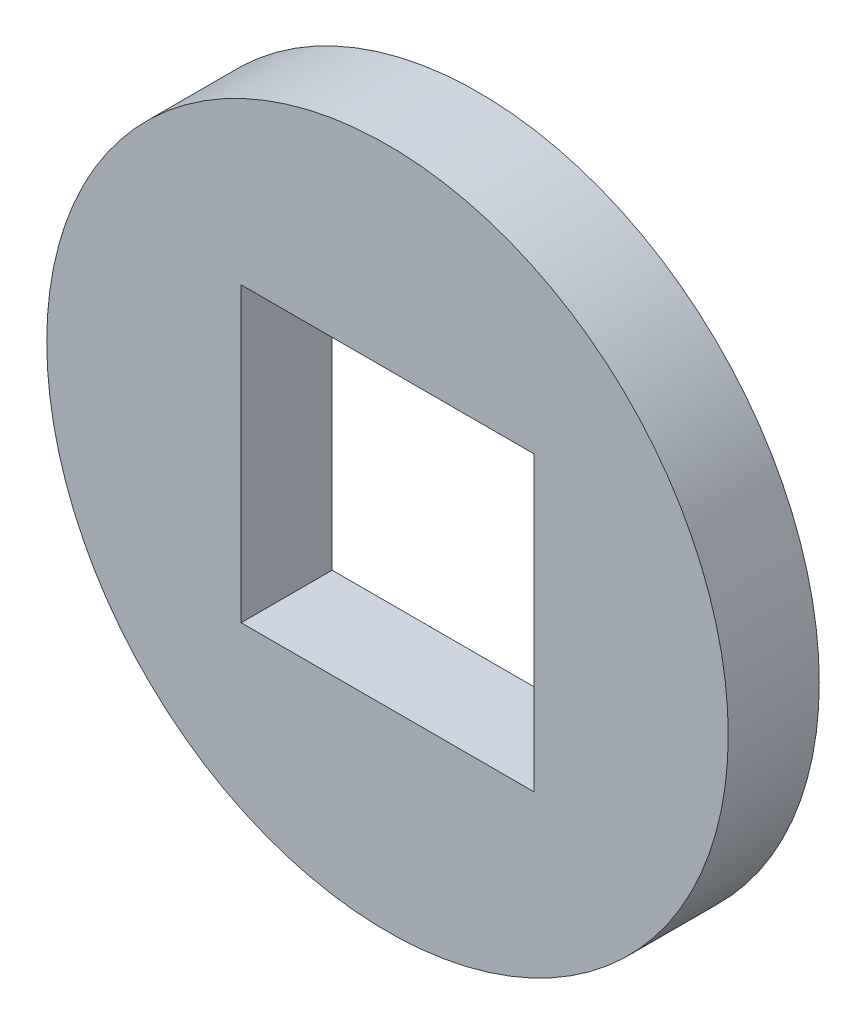
ISO-10303-21;
HEADER;
FILE_DESCRIPTION(('STEP AP214'),'2;1');
FILE_NAME('part.step','',(''),(''),'','','');
FILE_SCHEMA(('AUTOMOTIVE_DESIGN { 1 0 10303 214 1 1 1 1 }'));
ENDSEC;
DATA;
#1=APPLICATION_CONTEXT('core data for automotive mechanical design processes');
#2=APPLICATION_PROTOCOL_DEFINITION('international standard','automotive_design',2000,#1);
#3=PRODUCT_CONTEXT('',#1,'mechanical');
#4=PRODUCT('Part','Part','',(#3));
#5=PRODUCT_RELATED_PRODUCT_CATEGORY('part','',(#4));
#6=PRODUCT_DEFINITION_FORMATION('','',#4);
#7=PRODUCT_DEFINITION_CONTEXT('part definition',#1,'design');
#8=PRODUCT_DEFINITION('design','',#6,#7);
#9=PRODUCT_DEFINITION_SHAPE('','',#8);
#10=(LENGTH_UNIT() NAMED_UNIT(*) SI_UNIT(.MILLI.,.METRE.));
#11=(NAMED_UNIT(*) PLANE_ANGLE_UNIT() SI_UNIT($,.RADIAN.));
#12=(NAMED_UNIT(*) SI_UNIT($,.STERADIAN.) SOLID_ANGLE_UNIT());
#13=UNCERTAINTY_MEASURE_WITH_UNIT(LENGTH_MEASURE(1.E-05),#10,'distance_accuracy_value','');
#14=(GEOMETRIC_REPRESENTATION_CONTEXT(3) GLOBAL_UNCERTAINTY_ASSIGNED_CONTEXT((#13)) GLOBAL_UNIT_ASSIGNED_CONTEXT((#10,
#11,#12)) REPRESENTATION_CONTEXT('',''));
#15=CARTESIAN_POINT('',(0.,0.,0.));
#16=DIRECTION('',(0.,0.,1.));
#17=DIRECTION('',(1.,0.,0.));
#18=AXIS2_PLACEMENT_3D('',#15,#16,#17);
#19=CARTESIAN_POINT('',(0.,0.,2.8829));
#20=DIRECTION('',(0.,0.,1.));
#21=DIRECTION('',(1.,0.,0.));
#22=AXIS2_PLACEMENT_3D('',#19,#20,#21);
#23=PLANE('',#22);
#24=CARTESIAN_POINT('',(0.,0.,2.8829));
#25=DIRECTION('',(0.,0.,1.));
#26=DIRECTION('',(1.,0.,0.));
#27=AXIS2_PLACEMENT_3D('',#24,#25,#26);
#28=CIRCLE('',#27,10.795);
#29=CARTESIAN_POINT('',(-10.795,0.,2.8829));
#30=VERTEX_POINT('',#29);
#31=EDGE_CURVE('E11',#30,#30,#28,.T.);
#32=ORIENTED_EDGE('',*,*,#31,.T.);
#33=EDGE_LOOP('',(#32));
#34=FACE_BOUND('',#33,.T.);
#35=DIRECTION('',(-1.,0.,0.));
#36=VECTOR('',#35,1.);
#37=CARTESIAN_POINT('',(-4.6355,4.6355,2.8829));
#38=LINE('',#37,#36);
#39=CARTESIAN_POINT('',(4.6355,4.6355,2.8829));
#40=VERTEX_POINT('',#39);
#41=CARTESIAN_POINT('',(-4.6355,4.6355,2.8829));
#42=VERTEX_POINT('',#41);
#43=EDGE_CURVE('E82',#40,#42,#38,.T.);
#44=ORIENTED_EDGE('',*,*,#43,.F.);
#45=DIRECTION('',(0.,1.,0.));
#46=VECTOR('',#45,1.);
#47=CARTESIAN_POINT('',(4.6355,4.6355,2.8829));
#48=LINE('',#47,#46);
#49=CARTESIAN_POINT('',(4.6355,-4.6355,2.8829));
#50=VERTEX_POINT('',#49);
#51=EDGE_CURVE('E74',#50,#40,#48,.T.);
#52=ORIENTED_EDGE('',*,*,#51,.F.);
#53=DIRECTION('',(1.,0.,0.));
#54=VECTOR('',#53,1.);
#55=CARTESIAN_POINT('',(-4.6355,-4.6355,2.8829));
#56=LINE('',#55,#54);
#57=CARTESIAN_POINT('',(-4.6355,-4.6355,2.8829));
#58=VERTEX_POINT('',#57);
#59=EDGE_CURVE('E95',#58,#50,#56,.T.);
#60=ORIENTED_EDGE('',*,*,#59,.F.);
#61=DIRECTION('',(0.,-1.,0.));
#62=VECTOR('',#61,1.);
#63=CARTESIAN_POINT('',(-4.6355,4.6355,2.8829));
#64=LINE('',#63,#62);
#65=EDGE_CURVE('E93',#42,#58,#64,.T.);
#66=ORIENTED_EDGE('',*,*,#65,.F.);
#67=EDGE_LOOP('',(#44,#52,#60,#66));
#68=FACE_BOUND('',#67,.T.);
#69=ADVANCED_FACE('F33',(#34,#68),#23,.T.);
#70=CARTESIAN_POINT('',(0.,0.,0.));
#71=DIRECTION('',(0.,0.,1.));
#72=DIRECTION('',(1.,0.,0.));
#73=AXIS2_PLACEMENT_3D('',#70,#71,#72);
#74=PLANE('',#73);
#75=CARTESIAN_POINT('',(0.,0.,0.));
#76=DIRECTION('',(0.,0.,1.));
#77=DIRECTION('',(1.,0.,0.));
#78=AXIS2_PLACEMENT_3D('',#75,#76,#77);
#79=CIRCLE('',#78,10.795);
#80=CARTESIAN_POINT('',(-10.795,0.,0.));
#81=VERTEX_POINT('',#80);
#82=EDGE_CURVE('E37',#81,#81,#79,.T.);
#83=ORIENTED_EDGE('',*,*,#82,.F.);
#84=EDGE_LOOP('',(#83));
#85=FACE_BOUND('',#84,.T.);
#86=DIRECTION('',(0.,1.,0.));
#87=VECTOR('',#86,1.);
#88=CARTESIAN_POINT('',(4.6355,4.6355,0.));
#89=LINE('',#88,#87);
#90=CARTESIAN_POINT('',(4.6355,-4.6355,0.));
#91=VERTEX_POINT('',#90);
#92=CARTESIAN_POINT('',(4.6355,4.6355,0.));
#93=VERTEX_POINT('',#92);
#94=EDGE_CURVE('E56',#91,#93,#89,.T.);
#95=ORIENTED_EDGE('',*,*,#94,.T.);
#96=DIRECTION('',(-1.,0.,0.));
#97=VECTOR('',#96,1.);
#98=CARTESIAN_POINT('',(-4.6355,4.6355,0.));
#99=LINE('',#98,#97);
#100=CARTESIAN_POINT('',(-4.6355,4.6355,0.));
#101=VERTEX_POINT('',#100);
#102=EDGE_CURVE('E89',#93,#101,#99,.T.);
#103=ORIENTED_EDGE('',*,*,#102,.T.);
#104=DIRECTION('',(0.,-1.,0.));
#105=VECTOR('',#104,1.);
#106=CARTESIAN_POINT('',(-4.6355,4.6355,0.));
#107=LINE('',#106,#105);
#108=CARTESIAN_POINT('',(-4.6355,-4.6355,0.));
#109=VERTEX_POINT('',#108);
#110=EDGE_CURVE('E101',#101,#109,#107,.T.);
#111=ORIENTED_EDGE('',*,*,#110,.T.);
#112=DIRECTION('',(1.,0.,0.));
#113=VECTOR('',#112,1.);
#114=CARTESIAN_POINT('',(-4.6355,-4.6355,0.));
#115=LINE('',#114,#113);
#116=EDGE_CURVE('E83',#109,#91,#115,.T.);
#117=ORIENTED_EDGE('',*,*,#116,.T.);
#118=EDGE_LOOP('',(#95,#103,#111,#117));
#119=FACE_BOUND('',#118,.T.);
#120=ADVANCED_FACE('F112',(#85,#119),#74,.F.);
#121=CARTESIAN_POINT('',(0.,0.,2.8829));
#122=DIRECTION('',(0.,0.,-1.));
#123=DIRECTION('',(-1.,0.,0.));
#124=AXIS2_PLACEMENT_3D('',#121,#122,#123);
#125=CYLINDRICAL_SURFACE('',#124,10.795);
#126=CARTESIAN_POINT('',(-10.795,0.,2.8829));
#127=CARTESIAN_POINT('',(-10.795,0.,2.85286979166667));
#128=CARTESIAN_POINT('',(-10.795,0.,2.82283958333333));
#129=CARTESIAN_POINT('',(-10.795,0.,2.76277916666667));
#130=CARTESIAN_POINT('',(-10.795,0.,2.73274895833333));
#131=CARTESIAN_POINT('',(-10.795,0.,2.67268854166667));
#132=CARTESIAN_POINT('',(-10.795,0.,2.64265833333333));
#133=CARTESIAN_POINT('',(-10.795,0.,2.58259791666667));
#134=CARTESIAN_POINT('',(-10.795,0.,2.55256770833333));
#135=CARTESIAN_POINT('',(-10.795,0.,2.49250729166667));
#136=CARTESIAN_POINT('',(-10.795,0.,2.46247708333333));
#137=CARTESIAN_POINT('',(-10.795,0.,2.40241666666667));
#138=CARTESIAN_POINT('',(-10.795,0.,2.37238645833333));
#139=CARTESIAN_POINT('',(-10.795,0.,2.31232604166667));
#140=CARTESIAN_POINT('',(-10.795,0.,2.28229583333333));
#141=CARTESIAN_POINT('',(-10.795,0.,2.22223541666667));
#142=CARTESIAN_POINT('',(-10.795,0.,2.19220520833333));
#143=CARTESIAN_POINT('',(-10.795,0.,2.13214479166667));
#144=CARTESIAN_POINT('',(-10.795,0.,2.10211458333333));
#145=CARTESIAN_POINT('',(-10.795,0.,2.04205416666667));
#146=CARTESIAN_POINT('',(-10.795,0.,2.01202395833333));
#147=CARTESIAN_POINT('',(-10.795,0.,1.95196354166667));
#148=CARTESIAN_POINT('',(-10.795,0.,1.92193333333333));
#149=CARTESIAN_POINT('',(-10.795,0.,1.86187291666667));
#150=CARTESIAN_POINT('',(-10.795,0.,1.83184270833333));
#151=CARTESIAN_POINT('',(-10.795,0.,1.77178229166667));
#152=CARTESIAN_POINT('',(-10.795,0.,1.74175208333333));
#153=CARTESIAN_POINT('',(-10.795,0.,1.68169166666667));
#154=CARTESIAN_POINT('',(-10.795,0.,1.65166145833333));
#155=CARTESIAN_POINT('',(-10.795,0.,1.59160104166667));
#156=CARTESIAN_POINT('',(-10.795,0.,1.56157083333333));
#157=CARTESIAN_POINT('',(-10.795,0.,1.50151041666667));
#158=CARTESIAN_POINT('',(-10.795,0.,1.47148020833333));
#159=CARTESIAN_POINT('',(-10.795,0.,1.41141979166667));
#160=CARTESIAN_POINT('',(-10.795,0.,1.38138958333333));
#161=CARTESIAN_POINT('',(-10.795,0.,1.32132916666667));
#162=CARTESIAN_POINT('',(-10.795,0.,1.29129895833333));
#163=CARTESIAN_POINT('',(-10.795,0.,1.23123854166667));
#164=CARTESIAN_POINT('',(-10.795,0.,1.20120833333333));
#165=CARTESIAN_POINT('',(-10.795,0.,1.14114791666667));
#166=CARTESIAN_POINT('',(-10.795,0.,1.11111770833333));
#167=CARTESIAN_POINT('',(-10.795,0.,1.05105729166667));
#168=CARTESIAN_POINT('',(-10.795,0.,1.02102708333333));
#169=CARTESIAN_POINT('',(-10.795,0.,0.960966666666666));
#170=CARTESIAN_POINT('',(-10.795,0.,0.930936458333333));
#171=CARTESIAN_POINT('',(-10.795,0.,0.870876041666666));
#172=CARTESIAN_POINT('',(-10.795,0.,0.840845833333333));
#173=CARTESIAN_POINT('',(-10.795,0.,0.780785416666666));
#174=CARTESIAN_POINT('',(-10.795,0.,0.750755208333333));
#175=CARTESIAN_POINT('',(-10.795,0.,0.690694791666666));
#176=CARTESIAN_POINT('',(-10.795,0.,0.660664583333333));
#177=CARTESIAN_POINT('',(-10.795,0.,0.600604166666666));
#178=CARTESIAN_POINT('',(-10.795,0.,0.570573958333333));
#179=CARTESIAN_POINT('',(-10.795,0.,0.510513541666666));
#180=CARTESIAN_POINT('',(-10.795,0.,0.480483333333333));
#181=CARTESIAN_POINT('',(-10.795,0.,0.420422916666666));
#182=CARTESIAN_POINT('',(-10.795,0.,0.390392708333333));
#183=CARTESIAN_POINT('',(-10.795,0.,0.330332291666666));
#184=CARTESIAN_POINT('',(-10.795,0.,0.300302083333333));
#185=CARTESIAN_POINT('',(-10.795,0.,0.240241666666666));
#186=CARTESIAN_POINT('',(-10.795,0.,0.210211458333333));
#187=CARTESIAN_POINT('',(-10.795,0.,0.150151041666666));
#188=CARTESIAN_POINT('',(-10.795,0.,0.120120833333333));
#189=CARTESIAN_POINT('',(-10.795,0.,0.0600604166666661));
#190=CARTESIAN_POINT('',(-10.795,0.,0.0300302083333328));
#191=CARTESIAN_POINT('',(-10.795,0.,0.));
#192=B_SPLINE_CURVE_WITH_KNOTS('',3,(#126,#127,#128,#129,#130,#131,#132,#133,#134,#135,#136,
#137,#138,#139,#140,#141,#142,#143,#144,#145,#146,#147,#148,#149,#150,#151,#152,#153,#154,#155,
#156,#157,#158,#159,#160,#161,#162,#163,#164,#165,#166,#167,#168,#169,#170,#171,#172,#173,#174,
#175,#176,#177,#178,#179,#180,#181,#182,#183,#184,#185,#186,#187,#188,#189,#190,#191),
.UNSPECIFIED.,.F.,.F.,(4,2,2,2,2,2,2,2,2,2,2,2,2,2,2,2,2,2,2,2,2,2,2,2,2,2,2,2,2,2,2,2,4),(0.,
0.0900906250000002,0.18018125,0.270271875,0.3603625,0.450453125,0.54054375,0.630634375,0.720725,
0.810815625,0.90090625,0.990996875,1.0810875,1.171178125,1.26126875,1.351359375,1.44145,
1.531540625,1.62163125,1.711721875,1.8018125,1.891903125,1.98199375,2.072084375,2.162175,
2.252265625,2.34235625,2.432446875,2.5225375,2.612628125,2.70271875,2.792809375,2.8829),.UNSPECIFIED.);
#193=EDGE_CURVE('BSEAM35',#30,#81,#192,.T.);
#194=ORIENTED_EDGE('',*,*,#31,.F.);
#195=ORIENTED_EDGE('',*,*,#82,.T.);
#196=ORIENTED_EDGE('',*,*,#193,.T.);
#197=ORIENTED_EDGE('',*,*,#193,.F.);
#198=EDGE_LOOP('',(#194,#196,#195,#197));
#199=FACE_BOUND('',#198,.T.);
#200=ADVANCED_FACE('F35',(#199),#125,.T.);
#201=CARTESIAN_POINT('',(4.6355,4.6355,2.8829));
#202=DIRECTION('',(-1.,0.,0.));
#203=DIRECTION('',(0.,0.,1.));
#204=AXIS2_PLACEMENT_3D('',#201,#202,#203);
#205=PLANE('',#204);
#206=ORIENTED_EDGE('',*,*,#94,.F.);
#207=DIRECTION('',(0.,0.,-1.));
#208=VECTOR('',#207,1.);
#209=CARTESIAN_POINT('',(4.6355,-4.6355,2.8829));
#210=LINE('',#209,#208);
#211=EDGE_CURVE('E78',#50,#91,#210,.T.);
#212=ORIENTED_EDGE('',*,*,#211,.F.);
#213=ORIENTED_EDGE('',*,*,#51,.T.);
#214=DIRECTION('',(0.,0.,-1.));
#215=VECTOR('',#214,1.);
#216=CARTESIAN_POINT('',(4.6355,4.6355,2.8829));
#217=LINE('',#216,#215);
#218=EDGE_CURVE('E77',#40,#93,#217,.T.);
#219=ORIENTED_EDGE('',*,*,#218,.T.);
#220=EDGE_LOOP('',(#206,#212,#213,#219));
#221=FACE_BOUND('',#220,.T.);
#222=ADVANCED_FACE('F76',(#221),#205,.T.);
#223=CARTESIAN_POINT('',(-4.6355,4.6355,2.8829));
#224=DIRECTION('',(0.,-1.,0.));
#225=DIRECTION('',(0.,0.,-1.));
#226=AXIS2_PLACEMENT_3D('',#223,#224,#225);
#227=PLANE('',#226);
#228=ORIENTED_EDGE('',*,*,#102,.F.);
#229=ORIENTED_EDGE('',*,*,#218,.F.);
#230=ORIENTED_EDGE('',*,*,#43,.T.);
#231=DIRECTION('',(0.,0.,-1.));
#232=VECTOR('',#231,1.);
#233=CARTESIAN_POINT('',(-4.6355,4.6355,2.8829));
#234=LINE('',#233,#232);
#235=EDGE_CURVE('E90',#42,#101,#234,.T.);
#236=ORIENTED_EDGE('',*,*,#235,.T.);
#237=EDGE_LOOP('',(#228,#229,#230,#236));
#238=FACE_BOUND('',#237,.T.);
#239=ADVANCED_FACE('F86',(#238),#227,.T.);
#240=CARTESIAN_POINT('',(-4.6355,4.6355,2.8829));
#241=DIRECTION('',(1.,0.,0.));
#242=DIRECTION('',(0.,1.,0.));
#243=AXIS2_PLACEMENT_3D('',#240,#241,#242);
#244=PLANE('',#243);
#245=ORIENTED_EDGE('',*,*,#110,.F.);
#246=ORIENTED_EDGE('',*,*,#235,.F.);
#247=ORIENTED_EDGE('',*,*,#65,.T.);
#248=DIRECTION('',(0.,0.,-1.));
#249=VECTOR('',#248,1.);
#250=CARTESIAN_POINT('',(-4.6355,-4.6355,2.8829));
#251=LINE('',#250,#249);
#252=EDGE_CURVE('E48',#58,#109,#251,.T.);
#253=ORIENTED_EDGE('',*,*,#252,.T.);
#254=EDGE_LOOP('',(#245,#246,#247,#253));
#255=FACE_BOUND('',#254,.T.);
#256=ADVANCED_FACE('F110',(#255),#244,.T.);
#257=CARTESIAN_POINT('',(-4.6355,-4.6355,2.8829));
#258=DIRECTION('',(0.,1.,0.));
#259=DIRECTION('',(0.,0.,1.));
#260=AXIS2_PLACEMENT_3D('',#257,#258,#259);
#261=PLANE('',#260);
#262=ORIENTED_EDGE('',*,*,#116,.F.);
#263=ORIENTED_EDGE('',*,*,#252,.F.);
#264=ORIENTED_EDGE('',*,*,#59,.T.);
#265=ORIENTED_EDGE('',*,*,#211,.T.);
#266=EDGE_LOOP('',(#262,#263,#264,#265));
#267=FACE_BOUND('',#266,.T.);
#268=ADVANCED_FACE('F113',(#267),#261,.T.);
#269=CLOSED_SHELL('',(#69,#120,#200,#222,#239,#256,#268));
#270=MANIFOLD_SOLID_BREP('B2',#269);
#271=ADVANCED_BREP_SHAPE_REPRESENTATION('',(#18,#270),#14);
#272=SHAPE_DEFINITION_REPRESENTATION(#9,#271);
ENDSEC;
END-ISO-10303-21;
